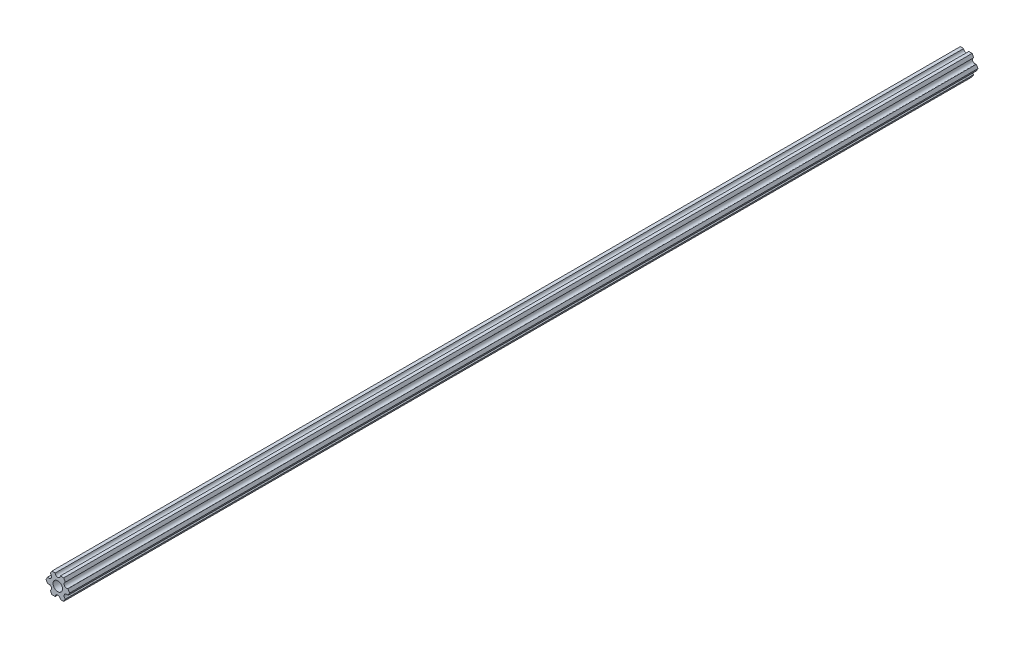
ISO-10303-21;
HEADER;
FILE_DESCRIPTION(('STEP AP214'),'2;1');
FILE_NAME('part.step','',(''),(''),'','','');
FILE_SCHEMA(('AUTOMOTIVE_DESIGN { 1 0 10303 214 1 1 1 1 }'));
ENDSEC;
DATA;
#1=APPLICATION_CONTEXT('core data for automotive mechanical design processes');
#2=APPLICATION_PROTOCOL_DEFINITION('international standard','automotive_design',2000,#1);
#3=PRODUCT_CONTEXT('',#1,'mechanical');
#4=PRODUCT('Part','Part','',(#3));
#5=PRODUCT_RELATED_PRODUCT_CATEGORY('part','',(#4));
#6=PRODUCT_DEFINITION_FORMATION('','',#4);
#7=PRODUCT_DEFINITION_CONTEXT('part definition',#1,'design');
#8=PRODUCT_DEFINITION('design','',#6,#7);
#9=PRODUCT_DEFINITION_SHAPE('','',#8);
#10=(LENGTH_UNIT() NAMED_UNIT(*) SI_UNIT(.MILLI.,.METRE.));
#11=(NAMED_UNIT(*) PLANE_ANGLE_UNIT() SI_UNIT($,.RADIAN.));
#12=(NAMED_UNIT(*) SI_UNIT($,.STERADIAN.) SOLID_ANGLE_UNIT());
#13=UNCERTAINTY_MEASURE_WITH_UNIT(LENGTH_MEASURE(1.E-05),#10,'distance_accuracy_value','');
#14=(GEOMETRIC_REPRESENTATION_CONTEXT(3) GLOBAL_UNCERTAINTY_ASSIGNED_CONTEXT((#13)) GLOBAL_UNIT_ASSIGNED_CONTEXT((#10,
#11,#12)) REPRESENTATION_CONTEXT('',''));
#15=CARTESIAN_POINT('',(0.,0.,0.));
#16=DIRECTION('',(0.,0.,1.));
#17=DIRECTION('',(1.,0.,0.));
#18=AXIS2_PLACEMENT_3D('',#15,#16,#17);
#19=CARTESIAN_POINT('',(5.49926112168156,3.17500033315933,282.575));
#20=DIRECTION('',(0.,0.,1.));
#21=DIRECTION('',(1.,0.,0.));
#22=AXIS2_PLACEMENT_3D('',#19,#20,#21);
#23=PLANE('',#22);
#24=DIRECTION('',(0.499999947533953,0.866025434075723,0.));
#25=VECTOR('',#24,1.);
#26=CARTESIAN_POINT('',(6.29301142309098,-1.80018429024546,282.575));
#27=LINE('',#26,#25);
#28=CARTESIAN_POINT('',(6.29301142309098,-1.80018429024546,282.575));
#29=VERTEX_POINT('',#28);
#30=CARTESIAN_POINT('',(7.33234841870826,4.44212519169686E-07,282.575));
#31=VERTEX_POINT('',#30);
#32=EDGE_CURVE('E256',#29,#31,#27,.T.);
#33=ORIENTED_EDGE('',*,*,#32,.T.);
#34=DIRECTION('',(-0.500000052466056,0.866025373493145,0.));
#35=VECTOR('',#34,1.);
#36=CARTESIAN_POINT('',(7.33234841870826,4.44212519169686E-07,282.575));
#37=LINE('',#36,#35);
#38=CARTESIAN_POINT('',(6.29301120497139,1.80018505273894,282.575));
#39=VERTEX_POINT('',#38);
#40=EDGE_CURVE('E132',#31,#39,#37,.T.);
#41=ORIENTED_EDGE('',*,*,#40,.T.);
#42=CARTESIAN_POINT('',(5.49926112168156,3.17500033315933,282.575));
#43=DIRECTION('',(0.,0.,-1.));
#44=DIRECTION('',(1.,0.,0.));
#45=AXIS2_PLACEMENT_3D('',#42,#43,#44);
#46=CIRCLE('',#45,1.5875);
#47=CARTESIAN_POINT('',(4.70551103839172,4.54981561357972,282.575));
#48=VERTEX_POINT('',#47);
#49=EDGE_CURVE('E317',#39,#48,#46,.T.);
#50=ORIENTED_EDGE('',*,*,#49,.T.);
#51=DIRECTION('',(-0.500000052466046,0.866025373493151,0.));
#52=VECTOR('',#51,1.);
#53=CARTESIAN_POINT('',(4.70551103839172,4.54981561357972,282.575));
#54=LINE('',#53,#52);
#55=CARTESIAN_POINT('',(3.66617382465481,6.35000022210627,282.575));
#56=VERTEX_POINT('',#55);
#57=EDGE_CURVE('E337',#48,#56,#54,.T.);
#58=ORIENTED_EDGE('',*,*,#57,.T.);
#59=DIRECTION('',(-0.999999999999998,-6.05825850611185E-08,0.));
#60=VECTOR('',#59,1.);
#61=CARTESIAN_POINT('',(3.66617382465481,6.35000022210627,282.575));
#62=LINE('',#61,#60);
#63=CARTESIAN_POINT('',(1.58749961530074,6.35000009617482,282.575));
#64=VERTEX_POINT('',#63);
#65=EDGE_CURVE('E333',#56,#64,#62,.T.);
#66=ORIENTED_EDGE('',*,*,#65,.T.);
#67=CARTESIAN_POINT('',(-3.84699260060323E-07,6.35,282.575));
#68=DIRECTION('',(0.,0.,-1.));
#69=DIRECTION('',(1.,0.,0.));
#70=AXIS2_PLACEMENT_3D('',#67,#68,#69);
#71=CIRCLE('',#70,1.5875);
#72=CARTESIAN_POINT('',(-1.58750038469926,6.34999990382518,282.575));
#73=VERTEX_POINT('',#72);
#74=EDGE_CURVE('E336',#64,#73,#71,.T.);
#75=ORIENTED_EDGE('',*,*,#74,.T.);
#76=DIRECTION('',(-0.999999999999998,-6.05825963273174E-08,0.));
#77=VECTOR('',#76,1.);
#78=CARTESIAN_POINT('',(-1.58750038469926,6.34999990382518,282.575));
#79=LINE('',#78,#77);
#80=CARTESIAN_POINT('',(-3.66617459405349,6.3499997778937,282.575));
#81=VERTEX_POINT('',#80);
#82=EDGE_CURVE('E341',#73,#81,#79,.T.);
#83=ORIENTED_EDGE('',*,*,#82,.T.);
#84=DIRECTION('',(-0.499999947533942,-0.866025434075729,0.));
#85=VECTOR('',#84,1.);
#86=CARTESIAN_POINT('',(-3.66617459405349,6.3499997778937,282.575));
#87=LINE('',#86,#85);
#88=CARTESIAN_POINT('',(-4.70551158967065,4.54981504343587,282.575));
#89=VERTEX_POINT('',#88);
#90=EDGE_CURVE('E348',#81,#89,#87,.T.);
#91=ORIENTED_EDGE('',*,*,#90,.T.);
#92=CARTESIAN_POINT('',(-5.49926150638082,3.17499966684067,282.575));
#93=DIRECTION('',(0.,0.,-1.));
#94=DIRECTION('',(1.,0.,0.));
#95=AXIS2_PLACEMENT_3D('',#92,#93,#94);
#96=CIRCLE('',#95,1.5875);
#97=CARTESIAN_POINT('',(-6.29301142309098,1.80018429024547,282.575));
#98=VERTEX_POINT('',#97);
#99=EDGE_CURVE('E351',#89,#98,#96,.T.);
#100=ORIENTED_EDGE('',*,*,#99,.T.);
#101=DIRECTION('',(-0.499999947533951,-0.866025434075724,0.));
#102=VECTOR('',#101,1.);
#103=CARTESIAN_POINT('',(-6.29301142309098,1.80018429024547,282.575));
#104=LINE('',#103,#102);
#105=CARTESIAN_POINT('',(-7.33234841870826,-4.44212523790841E-07,282.575));
#106=VERTEX_POINT('',#105);
#107=EDGE_CURVE('E354',#98,#106,#104,.T.);
#108=ORIENTED_EDGE('',*,*,#107,.T.);
#109=DIRECTION('',(0.500000052466045,-0.866025373493151,0.));
#110=VECTOR('',#109,1.);
#111=CARTESIAN_POINT('',(-7.33234841870826,-4.44212523790841E-07,282.575));
#112=LINE('',#111,#110);
#113=CARTESIAN_POINT('',(-6.29301120497141,-1.80018505273897,282.575));
#114=VERTEX_POINT('',#113);
#115=EDGE_CURVE('E357',#106,#114,#112,.T.);
#116=ORIENTED_EDGE('',*,*,#115,.T.);
#117=CARTESIAN_POINT('',(-5.49926112168156,-3.17500033315934,282.575));
#118=DIRECTION('',(0.,0.,-1.));
#119=DIRECTION('',(1.,0.,0.));
#120=AXIS2_PLACEMENT_3D('',#117,#118,#119);
#121=CIRCLE('',#120,1.5875);
#122=CARTESIAN_POINT('',(-4.70551103839172,-4.54981561357972,282.575));
#123=VERTEX_POINT('',#122);
#124=EDGE_CURVE('E360',#114,#123,#121,.T.);
#125=ORIENTED_EDGE('',*,*,#124,.T.);
#126=DIRECTION('',(0.500000052466045,-0.866025373493151,0.));
#127=VECTOR('',#126,1.);
#128=CARTESIAN_POINT('',(-4.70551103839172,-4.54981561357972,282.575));
#129=LINE('',#128,#127);
#130=CARTESIAN_POINT('',(-3.66617382465481,-6.35000022210628,282.575));
#131=VERTEX_POINT('',#130);
#132=EDGE_CURVE('E363',#123,#131,#129,.T.);
#133=ORIENTED_EDGE('',*,*,#132,.T.);
#134=DIRECTION('',(0.999999999999998,6.05825854783851E-08,0.));
#135=VECTOR('',#134,1.);
#136=CARTESIAN_POINT('',(-3.66617382465481,-6.35000022210628,282.575));
#137=LINE('',#136,#135);
#138=CARTESIAN_POINT('',(-1.58749961530074,-6.35000009617482,282.575));
#139=VERTEX_POINT('',#138);
#140=EDGE_CURVE('E366',#131,#139,#137,.T.);
#141=ORIENTED_EDGE('',*,*,#140,.T.);
#142=CARTESIAN_POINT('',(3.8469926204343E-07,-6.35,282.575));
#143=DIRECTION('',(0.,0.,-1.));
#144=DIRECTION('',(1.,0.,0.));
#145=AXIS2_PLACEMENT_3D('',#142,#143,#144);
#146=CIRCLE('',#145,1.5875);
#147=CARTESIAN_POINT('',(1.58750038469926,-6.34999990382518,282.575));
#148=VERTEX_POINT('',#147);
#149=EDGE_CURVE('E181',#139,#148,#146,.T.);
#150=ORIENTED_EDGE('',*,*,#149,.T.);
#151=DIRECTION('',(0.999999999999998,6.05825721258438E-08,0.));
#152=VECTOR('',#151,1.);
#153=CARTESIAN_POINT('',(1.58750038469926,-6.34999990382518,282.575));
#154=LINE('',#153,#152);
#155=CARTESIAN_POINT('',(3.66617459405346,-6.34999977789375,282.575));
#156=VERTEX_POINT('',#155);
#157=EDGE_CURVE('E175',#148,#156,#154,.T.);
#158=ORIENTED_EDGE('',*,*,#157,.T.);
#159=DIRECTION('',(0.499999947533941,0.86602543407573,0.));
#160=VECTOR('',#159,1.);
#161=CARTESIAN_POINT('',(3.66617459405346,-6.34999977789375,282.575));
#162=LINE('',#161,#160);
#163=CARTESIAN_POINT('',(4.70551158967065,-4.54981504343587,282.575));
#164=VERTEX_POINT('',#163);
#165=EDGE_CURVE('E179',#156,#164,#162,.T.);
#166=ORIENTED_EDGE('',*,*,#165,.T.);
#167=CARTESIAN_POINT('',(5.49926150638082,-3.17499966684067,282.575));
#168=DIRECTION('',(0.,0.,-1.));
#169=DIRECTION('',(1.,0.,0.));
#170=AXIS2_PLACEMENT_3D('',#167,#168,#169);
#171=CIRCLE('',#170,1.58750000000001);
#172=EDGE_CURVE('E59',#164,#29,#171,.T.);
#173=ORIENTED_EDGE('',*,*,#172,.T.);
#174=EDGE_LOOP('',(#33,#41,#50,#58,#66,#75,#83,#91,#100,#108,#116,#125,#133,#141,#150,#158,#166,#173));
#175=FACE_BOUND('',#174,.T.);
#176=CARTESIAN_POINT('',(0.,0.,282.575));
#177=DIRECTION('',(0.,0.,1.));
#178=DIRECTION('',(1.,0.,0.));
#179=AXIS2_PLACEMENT_3D('',#176,#177,#178);
#180=CIRCLE('',#179,2.9337);
#181=CARTESIAN_POINT('',(2.9337,0.,282.575));
#182=VERTEX_POINT('',#181);
#183=EDGE_CURVE('E208',#182,#182,#180,.T.);
#184=ORIENTED_EDGE('',*,*,#183,.F.);
#185=EDGE_LOOP('',(#184));
#186=FACE_BOUND('',#185,.T.);
#187=ADVANCED_FACE('F41',(#175,#186),#23,.T.);
#188=CARTESIAN_POINT('',(5.49926112168156,3.17500033315933,-282.575));
#189=DIRECTION('',(0.,0.,1.));
#190=DIRECTION('',(1.,0.,0.));
#191=AXIS2_PLACEMENT_3D('',#188,#189,#190);
#192=PLANE('',#191);
#193=DIRECTION('',(0.499999947533953,0.866025434075723,0.));
#194=VECTOR('',#193,1.);
#195=CARTESIAN_POINT('',(6.29301142309098,-1.80018429024546,-282.575));
#196=LINE('',#195,#194);
#197=CARTESIAN_POINT('',(6.29301142309098,-1.80018429024546,-282.575));
#198=VERTEX_POINT('',#197);
#199=CARTESIAN_POINT('',(7.33234841870826,4.44212519169686E-07,-282.575));
#200=VERTEX_POINT('',#199);
#201=EDGE_CURVE('E203',#198,#200,#196,.T.);
#202=ORIENTED_EDGE('',*,*,#201,.F.);
#203=CARTESIAN_POINT('',(5.49926150638082,-3.17499966684067,-282.575));
#204=DIRECTION('',(0.,0.,-1.));
#205=DIRECTION('',(1.,0.,0.));
#206=AXIS2_PLACEMENT_3D('',#203,#204,#205);
#207=CIRCLE('',#206,1.58750000000001);
#208=CARTESIAN_POINT('',(4.70551158967065,-4.54981504343587,-282.575));
#209=VERTEX_POINT('',#208);
#210=EDGE_CURVE('E124',#209,#198,#207,.T.);
#211=ORIENTED_EDGE('',*,*,#210,.F.);
#212=DIRECTION('',(0.499999947533941,0.86602543407573,0.));
#213=VECTOR('',#212,1.);
#214=CARTESIAN_POINT('',(3.66617459405346,-6.34999977789375,-282.575));
#215=LINE('',#214,#213);
#216=CARTESIAN_POINT('',(3.66617459405346,-6.34999977789375,-282.575));
#217=VERTEX_POINT('',#216);
#218=EDGE_CURVE('E118',#217,#209,#215,.T.);
#219=ORIENTED_EDGE('',*,*,#218,.F.);
#220=DIRECTION('',(0.999999999999998,6.05825721258438E-08,0.));
#221=VECTOR('',#220,1.);
#222=CARTESIAN_POINT('',(1.58750038469926,-6.34999990382518,-282.575));
#223=LINE('',#222,#221);
#224=CARTESIAN_POINT('',(1.58750038469926,-6.34999990382518,-282.575));
#225=VERTEX_POINT('',#224);
#226=EDGE_CURVE('E190',#225,#217,#223,.T.);
#227=ORIENTED_EDGE('',*,*,#226,.F.);
#228=CARTESIAN_POINT('',(3.8469926204343E-07,-6.35,-282.575));
#229=DIRECTION('',(0.,0.,-1.));
#230=DIRECTION('',(1.,0.,0.));
#231=AXIS2_PLACEMENT_3D('',#228,#229,#230);
#232=CIRCLE('',#231,1.5875);
#233=CARTESIAN_POINT('',(-1.58749961530074,-6.35000009617482,-282.575));
#234=VERTEX_POINT('',#233);
#235=EDGE_CURVE('E247',#234,#225,#232,.T.);
#236=ORIENTED_EDGE('',*,*,#235,.F.);
#237=DIRECTION('',(0.999999999999998,6.05825854783851E-08,0.));
#238=VECTOR('',#237,1.);
#239=CARTESIAN_POINT('',(-3.66617382465481,-6.35000022210628,-282.575));
#240=LINE('',#239,#238);
#241=CARTESIAN_POINT('',(-3.66617382465481,-6.35000022210628,-282.575));
#242=VERTEX_POINT('',#241);
#243=EDGE_CURVE('E244',#242,#234,#240,.T.);
#244=ORIENTED_EDGE('',*,*,#243,.F.);
#245=DIRECTION('',(0.500000052466045,-0.866025373493151,0.));
#246=VECTOR('',#245,1.);
#247=CARTESIAN_POINT('',(-4.70551103839172,-4.54981561357972,-282.575));
#248=LINE('',#247,#246);
#249=CARTESIAN_POINT('',(-4.70551103839172,-4.54981561357972,-282.575));
#250=VERTEX_POINT('',#249);
#251=EDGE_CURVE('E241',#250,#242,#248,.T.);
#252=ORIENTED_EDGE('',*,*,#251,.F.);
#253=CARTESIAN_POINT('',(-5.49926112168156,-3.17500033315934,-282.575));
#254=DIRECTION('',(0.,0.,-1.));
#255=DIRECTION('',(1.,0.,0.));
#256=AXIS2_PLACEMENT_3D('',#253,#254,#255);
#257=CIRCLE('',#256,1.5875);
#258=CARTESIAN_POINT('',(-6.29301120497141,-1.80018505273897,-282.575));
#259=VERTEX_POINT('',#258);
#260=EDGE_CURVE('E238',#259,#250,#257,.T.);
#261=ORIENTED_EDGE('',*,*,#260,.F.);
#262=DIRECTION('',(0.500000052466045,-0.866025373493151,0.));
#263=VECTOR('',#262,1.);
#264=CARTESIAN_POINT('',(-7.33234841870826,-4.44212523790841E-07,-282.575));
#265=LINE('',#264,#263);
#266=CARTESIAN_POINT('',(-7.33234841870826,-4.44212523790841E-07,-282.575));
#267=VERTEX_POINT('',#266);
#268=EDGE_CURVE('E235',#267,#259,#265,.T.);
#269=ORIENTED_EDGE('',*,*,#268,.F.);
#270=DIRECTION('',(-0.499999947533951,-0.866025434075724,0.));
#271=VECTOR('',#270,1.);
#272=CARTESIAN_POINT('',(-6.29301142309098,1.80018429024547,-282.575));
#273=LINE('',#272,#271);
#274=CARTESIAN_POINT('',(-6.29301142309098,1.80018429024547,-282.575));
#275=VERTEX_POINT('',#274);
#276=EDGE_CURVE('E232',#275,#267,#273,.T.);
#277=ORIENTED_EDGE('',*,*,#276,.F.);
#278=CARTESIAN_POINT('',(-5.49926150638082,3.17499966684067,-282.575));
#279=DIRECTION('',(0.,0.,-1.));
#280=DIRECTION('',(1.,0.,0.));
#281=AXIS2_PLACEMENT_3D('',#278,#279,#280);
#282=CIRCLE('',#281,1.5875);
#283=CARTESIAN_POINT('',(-4.70551158967065,4.54981504343587,-282.575));
#284=VERTEX_POINT('',#283);
#285=EDGE_CURVE('E229',#284,#275,#282,.T.);
#286=ORIENTED_EDGE('',*,*,#285,.F.);
#287=DIRECTION('',(-0.499999947533942,-0.866025434075729,0.));
#288=VECTOR('',#287,1.);
#289=CARTESIAN_POINT('',(-3.66617459405349,6.3499997778937,-282.575));
#290=LINE('',#289,#288);
#291=CARTESIAN_POINT('',(-3.66617459405349,6.3499997778937,-282.575));
#292=VERTEX_POINT('',#291);
#293=EDGE_CURVE('E226',#292,#284,#290,.T.);
#294=ORIENTED_EDGE('',*,*,#293,.F.);
#295=DIRECTION('',(-0.999999999999998,-6.05825963273174E-08,0.));
#296=VECTOR('',#295,1.);
#297=CARTESIAN_POINT('',(-1.58750038469926,6.34999990382518,-282.575));
#298=LINE('',#297,#296);
#299=CARTESIAN_POINT('',(-1.58750038469926,6.34999990382518,-282.575));
#300=VERTEX_POINT('',#299);
#301=EDGE_CURVE('E223',#300,#292,#298,.T.);
#302=ORIENTED_EDGE('',*,*,#301,.F.);
#303=CARTESIAN_POINT('',(-3.84699260060323E-07,6.35,-282.575));
#304=DIRECTION('',(0.,0.,-1.));
#305=DIRECTION('',(1.,0.,0.));
#306=AXIS2_PLACEMENT_3D('',#303,#304,#305);
#307=CIRCLE('',#306,1.5875);
#308=CARTESIAN_POINT('',(1.58749961530074,6.35000009617482,-282.575));
#309=VERTEX_POINT('',#308);
#310=EDGE_CURVE('E220',#309,#300,#307,.T.);
#311=ORIENTED_EDGE('',*,*,#310,.F.);
#312=DIRECTION('',(-0.999999999999998,-6.05825850611185E-08,0.));
#313=VECTOR('',#312,1.);
#314=CARTESIAN_POINT('',(3.66617382465481,6.35000022210627,-282.575));
#315=LINE('',#314,#313);
#316=CARTESIAN_POINT('',(3.66617382465481,6.35000022210627,-282.575));
#317=VERTEX_POINT('',#316);
#318=EDGE_CURVE('E217',#317,#309,#315,.T.);
#319=ORIENTED_EDGE('',*,*,#318,.F.);
#320=DIRECTION('',(-0.500000052466046,0.866025373493151,0.));
#321=VECTOR('',#320,1.);
#322=CARTESIAN_POINT('',(4.70551103839172,4.54981561357972,-282.575));
#323=LINE('',#322,#321);
#324=CARTESIAN_POINT('',(4.70551103839172,4.54981561357972,-282.575));
#325=VERTEX_POINT('',#324);
#326=EDGE_CURVE('E214',#325,#317,#323,.T.);
#327=ORIENTED_EDGE('',*,*,#326,.F.);
#328=CARTESIAN_POINT('',(5.49926112168156,3.17500033315933,-282.575));
#329=DIRECTION('',(0.,0.,-1.));
#330=DIRECTION('',(1.,0.,0.));
#331=AXIS2_PLACEMENT_3D('',#328,#329,#330);
#332=CIRCLE('',#331,1.5875);
#333=CARTESIAN_POINT('',(6.29301120497139,1.80018505273894,-282.575));
#334=VERTEX_POINT('',#333);
#335=EDGE_CURVE('E211',#334,#325,#332,.T.);
#336=ORIENTED_EDGE('',*,*,#335,.F.);
#337=DIRECTION('',(-0.500000052466056,0.866025373493145,0.));
#338=VECTOR('',#337,1.);
#339=CARTESIAN_POINT('',(7.33234841870826,4.44212519169686E-07,-282.575));
#340=LINE('',#339,#338);
#341=EDGE_CURVE('E207',#200,#334,#340,.T.);
#342=ORIENTED_EDGE('',*,*,#341,.F.);
#343=EDGE_LOOP('',(#202,#211,#219,#227,#236,#244,#252,#261,#269,#277,#286,#294,#302,#311,#319,
#327,#336,#342));
#344=FACE_BOUND('',#343,.T.);
#345=CARTESIAN_POINT('',(0.,0.,-282.575));
#346=DIRECTION('',(0.,0.,1.));
#347=DIRECTION('',(1.,0.,0.));
#348=AXIS2_PLACEMENT_3D('',#345,#346,#347);
#349=CIRCLE('',#348,2.9337);
#350=CARTESIAN_POINT('',(2.9337,0.,-282.575));
#351=VERTEX_POINT('',#350);
#352=EDGE_CURVE('E593',#351,#351,#349,.T.);
#353=ORIENTED_EDGE('',*,*,#352,.T.);
#354=EDGE_LOOP('',(#353));
#355=FACE_BOUND('',#354,.T.);
#356=ADVANCED_FACE('F321',(#344,#355),#192,.F.);
#357=CARTESIAN_POINT('',(6.29301142309098,-1.80018429024546,282.575));
#358=DIRECTION('',(-0.866025434075723,0.499999947533953,0.));
#359=DIRECTION('',(-0.499999947533953,-0.866025434075723,0.));
#360=AXIS2_PLACEMENT_3D('',#357,#358,#359);
#361=PLANE('',#360);
#362=ORIENTED_EDGE('',*,*,#201,.T.);
#363=DIRECTION('',(0.,0.,-1.));
#364=VECTOR('',#363,1.);
#365=CARTESIAN_POINT('',(7.33234841870826,4.44212519169686E-07,282.575));
#366=LINE('',#365,#364);
#367=EDGE_CURVE('E11',#31,#200,#366,.T.);
#368=ORIENTED_EDGE('',*,*,#367,.F.);
#369=ORIENTED_EDGE('',*,*,#32,.F.);
#370=DIRECTION('',(0.,0.,-1.));
#371=VECTOR('',#370,1.);
#372=CARTESIAN_POINT('',(6.29301142309098,-1.80018429024546,282.575));
#373=LINE('',#372,#371);
#374=EDGE_CURVE('E199',#29,#198,#373,.T.);
#375=ORIENTED_EDGE('',*,*,#374,.T.);
#376=EDGE_LOOP('',(#362,#368,#369,#375));
#377=FACE_BOUND('',#376,.T.);
#378=ADVANCED_FACE('F43',(#377),#361,.F.);
#379=CARTESIAN_POINT('',(7.33234841870826,4.44212519169686E-07,282.575));
#380=DIRECTION('',(-0.866025373493145,-0.500000052466056,0.));
#381=DIRECTION('',(0.500000052466056,-0.866025373493145,0.));
#382=AXIS2_PLACEMENT_3D('',#379,#380,#381);
#383=PLANE('',#382);
#384=ORIENTED_EDGE('',*,*,#341,.T.);
#385=DIRECTION('',(0.,0.,-1.));
#386=VECTOR('',#385,1.);
#387=CARTESIAN_POINT('',(6.29301120497139,1.80018505273894,282.575));
#388=LINE('',#387,#386);
#389=EDGE_CURVE('E51',#39,#334,#388,.T.);
#390=ORIENTED_EDGE('',*,*,#389,.F.);
#391=ORIENTED_EDGE('',*,*,#40,.F.);
#392=ORIENTED_EDGE('',*,*,#367,.T.);
#393=EDGE_LOOP('',(#384,#390,#391,#392));
#394=FACE_BOUND('',#393,.T.);
#395=ADVANCED_FACE('F402',(#394),#383,.F.);
#396=CARTESIAN_POINT('',(5.49926112168156,3.17500033315933,282.575));
#397=DIRECTION('',(0.,0.,-1.));
#398=DIRECTION('',(-1.,0.,0.));
#399=AXIS2_PLACEMENT_3D('',#396,#397,#398);
#400=CYLINDRICAL_SURFACE('',#399,1.5875);
#401=ORIENTED_EDGE('',*,*,#335,.T.);
#402=DIRECTION('',(0.,0.,-1.));
#403=VECTOR('',#402,1.);
#404=CARTESIAN_POINT('',(4.70551103839172,4.54981561357972,282.575));
#405=LINE('',#404,#403);
#406=EDGE_CURVE('E307',#48,#325,#405,.T.);
#407=ORIENTED_EDGE('',*,*,#406,.F.);
#408=ORIENTED_EDGE('',*,*,#49,.F.);
#409=ORIENTED_EDGE('',*,*,#389,.T.);
#410=EDGE_LOOP('',(#401,#407,#408,#409));
#411=FACE_BOUND('',#410,.T.);
#412=ADVANCED_FACE('F315',(#411),#400,.F.);
#413=CARTESIAN_POINT('',(4.70551103839172,4.54981561357972,282.575));
#414=DIRECTION('',(-0.866025373493151,-0.500000052466046,0.));
#415=DIRECTION('',(0.500000052466046,-0.866025373493151,0.));
#416=AXIS2_PLACEMENT_3D('',#413,#414,#415);
#417=PLANE('',#416);
#418=ORIENTED_EDGE('',*,*,#326,.T.);
#419=DIRECTION('',(0.,0.,-1.));
#420=VECTOR('',#419,1.);
#421=CARTESIAN_POINT('',(3.66617382465481,6.35000022210627,282.575));
#422=LINE('',#421,#420);
#423=EDGE_CURVE('E303',#56,#317,#422,.T.);
#424=ORIENTED_EDGE('',*,*,#423,.F.);
#425=ORIENTED_EDGE('',*,*,#57,.F.);
#426=ORIENTED_EDGE('',*,*,#406,.T.);
#427=EDGE_LOOP('',(#418,#424,#425,#426));
#428=FACE_BOUND('',#427,.T.);
#429=ADVANCED_FACE('F327',(#428),#417,.F.);
#430=CARTESIAN_POINT('',(3.66617382465481,6.35000022210627,282.575));
#431=DIRECTION('',(6.05825850611185E-08,-0.999999999999998,0.));
#432=DIRECTION('',(0.999999999999998,6.05825850611185E-08,0.));
#433=AXIS2_PLACEMENT_3D('',#430,#431,#432);
#434=PLANE('',#433);
#435=ORIENTED_EDGE('',*,*,#318,.T.);
#436=DIRECTION('',(0.,0.,-1.));
#437=VECTOR('',#436,1.);
#438=CARTESIAN_POINT('',(1.58749961530074,6.35000009617482,282.575));
#439=LINE('',#438,#437);
#440=EDGE_CURVE('E299',#64,#309,#439,.T.);
#441=ORIENTED_EDGE('',*,*,#440,.F.);
#442=ORIENTED_EDGE('',*,*,#65,.F.);
#443=ORIENTED_EDGE('',*,*,#423,.T.);
#444=EDGE_LOOP('',(#435,#441,#442,#443));
#445=FACE_BOUND('',#444,.T.);
#446=ADVANCED_FACE('F331',(#445),#434,.F.);
#447=CARTESIAN_POINT('',(-3.84699260060323E-07,6.35,282.575));
#448=DIRECTION('',(0.,0.,-1.));
#449=DIRECTION('',(-1.,0.,0.));
#450=AXIS2_PLACEMENT_3D('',#447,#448,#449);
#451=CYLINDRICAL_SURFACE('',#450,1.5875);
#452=ORIENTED_EDGE('',*,*,#310,.T.);
#453=DIRECTION('',(0.,0.,-1.));
#454=VECTOR('',#453,1.);
#455=CARTESIAN_POINT('',(-1.58750038469926,6.34999990382518,282.575));
#456=LINE('',#455,#454);
#457=EDGE_CURVE('E295',#73,#300,#456,.T.);
#458=ORIENTED_EDGE('',*,*,#457,.F.);
#459=ORIENTED_EDGE('',*,*,#74,.F.);
#460=ORIENTED_EDGE('',*,*,#440,.T.);
#461=EDGE_LOOP('',(#452,#458,#459,#460));
#462=FACE_BOUND('',#461,.T.);
#463=ADVANCED_FACE('F415',(#462),#451,.F.);
#464=CARTESIAN_POINT('',(-1.58750038469926,6.34999990382518,282.575));
#465=DIRECTION('',(6.05825963273174E-08,-0.999999999999998,0.));
#466=DIRECTION('',(0.999999999999998,6.05825963273174E-08,0.));
#467=AXIS2_PLACEMENT_3D('',#464,#465,#466);
#468=PLANE('',#467);
#469=ORIENTED_EDGE('',*,*,#301,.T.);
#470=DIRECTION('',(0.,0.,-1.));
#471=VECTOR('',#470,1.);
#472=CARTESIAN_POINT('',(-3.66617459405349,6.3499997778937,282.575));
#473=LINE('',#472,#471);
#474=EDGE_CURVE('E291',#81,#292,#473,.T.);
#475=ORIENTED_EDGE('',*,*,#474,.F.);
#476=ORIENTED_EDGE('',*,*,#82,.F.);
#477=ORIENTED_EDGE('',*,*,#457,.T.);
#478=EDGE_LOOP('',(#469,#475,#476,#477));
#479=FACE_BOUND('',#478,.T.);
#480=ADVANCED_FACE('F418',(#479),#468,.F.);
#481=CARTESIAN_POINT('',(-3.66617459405349,6.3499997778937,282.575));
#482=DIRECTION('',(0.866025434075729,-0.499999947533942,0.));
#483=DIRECTION('',(0.499999947533942,0.866025434075729,0.));
#484=AXIS2_PLACEMENT_3D('',#481,#482,#483);
#485=PLANE('',#484);
#486=ORIENTED_EDGE('',*,*,#293,.T.);
#487=DIRECTION('',(0.,0.,-1.));
#488=VECTOR('',#487,1.);
#489=CARTESIAN_POINT('',(-4.70551158967065,4.54981504343587,282.575));
#490=LINE('',#489,#488);
#491=EDGE_CURVE('E287',#89,#284,#490,.T.);
#492=ORIENTED_EDGE('',*,*,#491,.F.);
#493=ORIENTED_EDGE('',*,*,#90,.F.);
#494=ORIENTED_EDGE('',*,*,#474,.T.);
#495=EDGE_LOOP('',(#486,#492,#493,#494));
#496=FACE_BOUND('',#495,.T.);
#497=ADVANCED_FACE('F422',(#496),#485,.F.);
#498=CARTESIAN_POINT('',(-5.49926150638082,3.17499966684067,282.575));
#499=DIRECTION('',(0.,0.,-1.));
#500=DIRECTION('',(-1.,0.,0.));
#501=AXIS2_PLACEMENT_3D('',#498,#499,#500);
#502=CYLINDRICAL_SURFACE('',#501,1.5875);
#503=ORIENTED_EDGE('',*,*,#285,.T.);
#504=DIRECTION('',(0.,0.,-1.));
#505=VECTOR('',#504,1.);
#506=CARTESIAN_POINT('',(-6.29301142309098,1.80018429024547,282.575));
#507=LINE('',#506,#505);
#508=EDGE_CURVE('E283',#98,#275,#507,.T.);
#509=ORIENTED_EDGE('',*,*,#508,.F.);
#510=ORIENTED_EDGE('',*,*,#99,.F.);
#511=ORIENTED_EDGE('',*,*,#491,.T.);
#512=EDGE_LOOP('',(#503,#509,#510,#511));
#513=FACE_BOUND('',#512,.T.);
#514=ADVANCED_FACE('F426',(#513),#502,.F.);
#515=CARTESIAN_POINT('',(-6.29301142309098,1.80018429024547,282.575));
#516=DIRECTION('',(0.866025434075724,-0.499999947533951,0.));
#517=DIRECTION('',(0.499999947533951,0.866025434075724,0.));
#518=AXIS2_PLACEMENT_3D('',#515,#516,#517);
#519=PLANE('',#518);
#520=ORIENTED_EDGE('',*,*,#276,.T.);
#521=DIRECTION('',(0.,0.,-1.));
#522=VECTOR('',#521,1.);
#523=CARTESIAN_POINT('',(-7.33234841870826,-4.44212523790841E-07,282.575));
#524=LINE('',#523,#522);
#525=EDGE_CURVE('E279',#106,#267,#524,.T.);
#526=ORIENTED_EDGE('',*,*,#525,.F.);
#527=ORIENTED_EDGE('',*,*,#107,.F.);
#528=ORIENTED_EDGE('',*,*,#508,.T.);
#529=EDGE_LOOP('',(#520,#526,#527,#528));
#530=FACE_BOUND('',#529,.T.);
#531=ADVANCED_FACE('F430',(#530),#519,.F.);
#532=CARTESIAN_POINT('',(-7.33234841870826,-4.44212523790841E-07,282.575));
#533=DIRECTION('',(0.866025373493151,0.500000052466045,0.));
#534=DIRECTION('',(-0.500000052466045,0.866025373493151,0.));
#535=AXIS2_PLACEMENT_3D('',#532,#533,#534);
#536=PLANE('',#535);
#537=ORIENTED_EDGE('',*,*,#268,.T.);
#538=DIRECTION('',(0.,0.,-1.));
#539=VECTOR('',#538,1.);
#540=CARTESIAN_POINT('',(-6.29301120497141,-1.80018505273897,282.575));
#541=LINE('',#540,#539);
#542=EDGE_CURVE('E275',#114,#259,#541,.T.);
#543=ORIENTED_EDGE('',*,*,#542,.F.);
#544=ORIENTED_EDGE('',*,*,#115,.F.);
#545=ORIENTED_EDGE('',*,*,#525,.T.);
#546=EDGE_LOOP('',(#537,#543,#544,#545));
#547=FACE_BOUND('',#546,.T.);
#548=ADVANCED_FACE('F434',(#547),#536,.F.);
#549=CARTESIAN_POINT('',(-5.49926112168156,-3.17500033315934,282.575));
#550=DIRECTION('',(0.,0.,-1.));
#551=DIRECTION('',(-1.,0.,0.));
#552=AXIS2_PLACEMENT_3D('',#549,#550,#551);
#553=CYLINDRICAL_SURFACE('',#552,1.5875);
#554=ORIENTED_EDGE('',*,*,#260,.T.);
#555=DIRECTION('',(0.,0.,-1.));
#556=VECTOR('',#555,1.);
#557=CARTESIAN_POINT('',(-4.70551103839172,-4.54981561357972,282.575));
#558=LINE('',#557,#556);
#559=EDGE_CURVE('E271',#123,#250,#558,.T.);
#560=ORIENTED_EDGE('',*,*,#559,.F.);
#561=ORIENTED_EDGE('',*,*,#124,.F.);
#562=ORIENTED_EDGE('',*,*,#542,.T.);
#563=EDGE_LOOP('',(#554,#560,#561,#562));
#564=FACE_BOUND('',#563,.T.);
#565=ADVANCED_FACE('F438',(#564),#553,.F.);
#566=CARTESIAN_POINT('',(-4.70551103839172,-4.54981561357972,282.575));
#567=DIRECTION('',(0.866025373493151,0.500000052466045,0.));
#568=DIRECTION('',(-0.500000052466045,0.866025373493151,0.));
#569=AXIS2_PLACEMENT_3D('',#566,#567,#568);
#570=PLANE('',#569);
#571=ORIENTED_EDGE('',*,*,#251,.T.);
#572=DIRECTION('',(0.,0.,-1.));
#573=VECTOR('',#572,1.);
#574=CARTESIAN_POINT('',(-3.66617382465481,-6.35000022210628,282.575));
#575=LINE('',#574,#573);
#576=EDGE_CURVE('E267',#131,#242,#575,.T.);
#577=ORIENTED_EDGE('',*,*,#576,.F.);
#578=ORIENTED_EDGE('',*,*,#132,.F.);
#579=ORIENTED_EDGE('',*,*,#559,.T.);
#580=EDGE_LOOP('',(#571,#577,#578,#579));
#581=FACE_BOUND('',#580,.T.);
#582=ADVANCED_FACE('F442',(#581),#570,.F.);
#583=CARTESIAN_POINT('',(-3.66617382465481,-6.35000022210628,282.575));
#584=DIRECTION('',(-6.05825854783851E-08,0.999999999999998,0.));
#585=DIRECTION('',(-0.999999999999998,-6.05825854783851E-08,0.));
#586=AXIS2_PLACEMENT_3D('',#583,#584,#585);
#587=PLANE('',#586);
#588=ORIENTED_EDGE('',*,*,#243,.T.);
#589=DIRECTION('',(0.,0.,-1.));
#590=VECTOR('',#589,1.);
#591=CARTESIAN_POINT('',(-1.58749961530074,-6.35000009617482,282.575));
#592=LINE('',#591,#590);
#593=EDGE_CURVE('E263',#139,#234,#592,.T.);
#594=ORIENTED_EDGE('',*,*,#593,.F.);
#595=ORIENTED_EDGE('',*,*,#140,.F.);
#596=ORIENTED_EDGE('',*,*,#576,.T.);
#597=EDGE_LOOP('',(#588,#594,#595,#596));
#598=FACE_BOUND('',#597,.T.);
#599=ADVANCED_FACE('F374',(#598),#587,.F.);
#600=CARTESIAN_POINT('',(3.8469926204343E-07,-6.35,282.575));
#601=DIRECTION('',(0.,0.,-1.));
#602=DIRECTION('',(-1.,0.,0.));
#603=AXIS2_PLACEMENT_3D('',#600,#601,#602);
#604=CYLINDRICAL_SURFACE('',#603,1.5875);
#605=ORIENTED_EDGE('',*,*,#235,.T.);
#606=DIRECTION('',(0.,0.,-1.));
#607=VECTOR('',#606,1.);
#608=CARTESIAN_POINT('',(1.58750038469926,-6.34999990382518,282.575));
#609=LINE('',#608,#607);
#610=EDGE_CURVE('E192',#148,#225,#609,.T.);
#611=ORIENTED_EDGE('',*,*,#610,.F.);
#612=ORIENTED_EDGE('',*,*,#149,.F.);
#613=ORIENTED_EDGE('',*,*,#593,.T.);
#614=EDGE_LOOP('',(#605,#611,#612,#613));
#615=FACE_BOUND('',#614,.T.);
#616=ADVANCED_FACE('F378',(#615),#604,.F.);
#617=CARTESIAN_POINT('',(1.58750038469926,-6.34999990382518,282.575));
#618=DIRECTION('',(-6.05825721258438E-08,0.999999999999998,0.));
#619=DIRECTION('',(-0.999999999999998,-6.05825721258438E-08,0.));
#620=AXIS2_PLACEMENT_3D('',#617,#618,#619);
#621=PLANE('',#620);
#622=ORIENTED_EDGE('',*,*,#226,.T.);
#623=DIRECTION('',(0.,0.,-1.));
#624=VECTOR('',#623,1.);
#625=CARTESIAN_POINT('',(3.66617459405346,-6.34999977789375,282.575));
#626=LINE('',#625,#624);
#627=EDGE_CURVE('E187',#156,#217,#626,.T.);
#628=ORIENTED_EDGE('',*,*,#627,.F.);
#629=ORIENTED_EDGE('',*,*,#157,.F.);
#630=ORIENTED_EDGE('',*,*,#610,.T.);
#631=EDGE_LOOP('',(#622,#628,#629,#630));
#632=FACE_BOUND('',#631,.T.);
#633=ADVANCED_FACE('F188',(#632),#621,.F.);
#634=CARTESIAN_POINT('',(3.66617459405346,-6.34999977789375,282.575));
#635=DIRECTION('',(-0.86602543407573,0.499999947533941,0.));
#636=DIRECTION('',(-0.499999947533941,-0.86602543407573,0.));
#637=AXIS2_PLACEMENT_3D('',#634,#635,#636);
#638=PLANE('',#637);
#639=ORIENTED_EDGE('',*,*,#218,.T.);
#640=DIRECTION('',(0.,0.,-1.));
#641=VECTOR('',#640,1.);
#642=CARTESIAN_POINT('',(4.70551158967065,-4.54981504343587,282.575));
#643=LINE('',#642,#641);
#644=EDGE_CURVE('E193',#164,#209,#643,.T.);
#645=ORIENTED_EDGE('',*,*,#644,.F.);
#646=ORIENTED_EDGE('',*,*,#165,.F.);
#647=ORIENTED_EDGE('',*,*,#627,.T.);
#648=EDGE_LOOP('',(#639,#645,#646,#647));
#649=FACE_BOUND('',#648,.T.);
#650=ADVANCED_FACE('F195',(#649),#638,.F.);
#651=CARTESIAN_POINT('',(5.49926150638082,-3.17499966684067,282.575));
#652=DIRECTION('',(0.,0.,-1.));
#653=DIRECTION('',(-1.,0.,0.));
#654=AXIS2_PLACEMENT_3D('',#651,#652,#653);
#655=CYLINDRICAL_SURFACE('',#654,1.58750000000001);
#656=ORIENTED_EDGE('',*,*,#210,.T.);
#657=ORIENTED_EDGE('',*,*,#374,.F.);
#658=ORIENTED_EDGE('',*,*,#172,.F.);
#659=ORIENTED_EDGE('',*,*,#644,.T.);
#660=EDGE_LOOP('',(#656,#657,#658,#659));
#661=FACE_BOUND('',#660,.T.);
#662=ADVANCED_FACE('F382',(#661),#655,.F.);
#663=CARTESIAN_POINT('',(0.,0.,282.575));
#664=DIRECTION('',(0.,0.,-1.));
#665=DIRECTION('',(-1.,0.,0.));
#666=AXIS2_PLACEMENT_3D('',#663,#664,#665);
#667=CYLINDRICAL_SURFACE('',#666,2.9337);
#668=ORIENTED_EDGE('',*,*,#183,.T.);
#669=EDGE_LOOP('',(#668));
#670=FACE_BOUND('',#669,.T.);
#671=ORIENTED_EDGE('',*,*,#352,.F.);
#672=EDGE_LOOP('',(#671));
#673=FACE_BOUND('',#672,.T.);
#674=ADVANCED_FACE('F384',(#670,#673),#667,.F.);
#675=CLOSED_SHELL('',(#187,#356,#378,#395,#412,#429,#446,#463,#480,#497,#514,#531,#548,#565,
#582,#599,#616,#633,#650,#662,#674));
#676=MANIFOLD_SOLID_BREP('B2',#675);
#677=ADVANCED_BREP_SHAPE_REPRESENTATION('',(#18,#676),#14);
#678=SHAPE_DEFINITION_REPRESENTATION(#9,#677);
ENDSEC;
END-ISO-10303-21;
